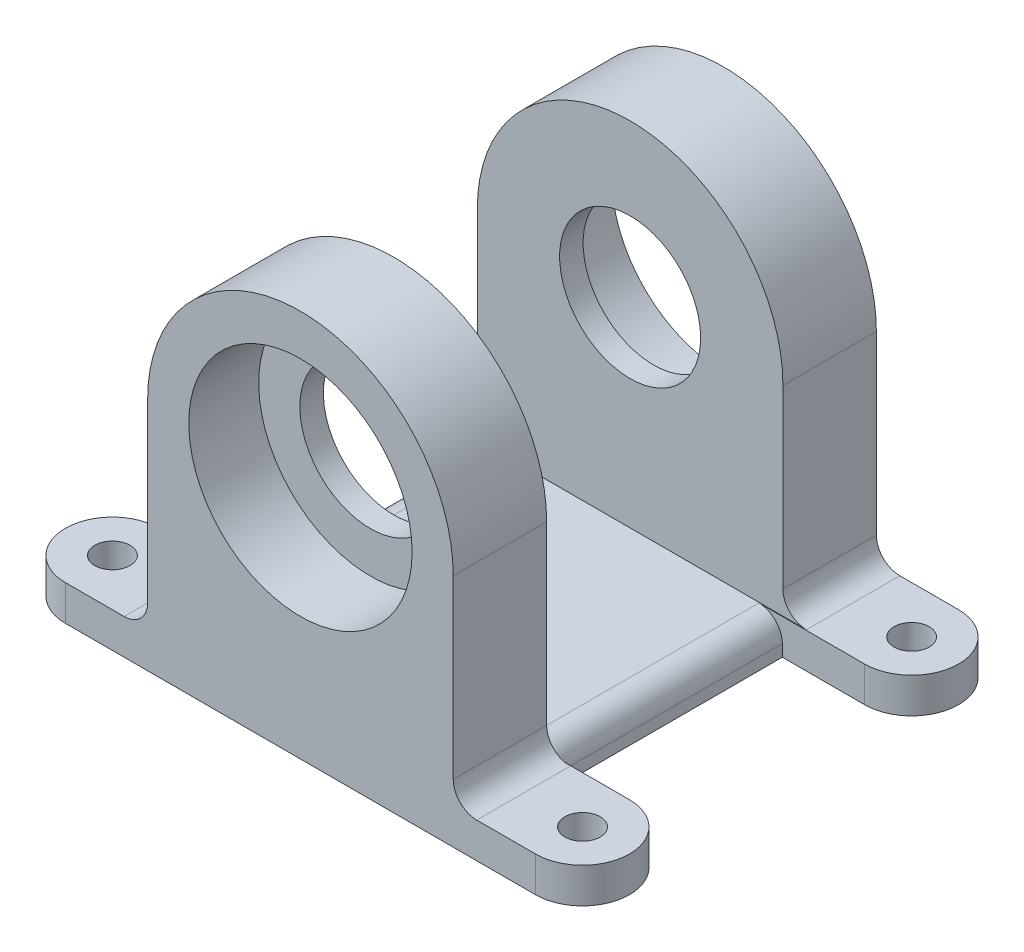
ISO-10303-21;
HEADER;
FILE_DESCRIPTION(('STEP AP214'),'2;1');
FILE_NAME('part.step','',(''),(''),'','','');
FILE_SCHEMA(('AUTOMOTIVE_DESIGN { 1 0 10303 214 1 1 1 1 }'));
ENDSEC;
DATA;
#1=APPLICATION_CONTEXT('core data for automotive mechanical design processes');
#2=APPLICATION_PROTOCOL_DEFINITION('international standard','automotive_design',2000,#1);
#3=PRODUCT_CONTEXT('',#1,'mechanical');
#4=PRODUCT('Part','Part','',(#3));
#5=PRODUCT_RELATED_PRODUCT_CATEGORY('part','',(#4));
#6=PRODUCT_DEFINITION_FORMATION('','',#4);
#7=PRODUCT_DEFINITION_CONTEXT('part definition',#1,'design');
#8=PRODUCT_DEFINITION('design','',#6,#7);
#9=PRODUCT_DEFINITION_SHAPE('','',#8);
#10=(LENGTH_UNIT() NAMED_UNIT(*) SI_UNIT(.MILLI.,.METRE.));
#11=(NAMED_UNIT(*) PLANE_ANGLE_UNIT() SI_UNIT($,.RADIAN.));
#12=(NAMED_UNIT(*) SI_UNIT($,.STERADIAN.) SOLID_ANGLE_UNIT());
#13=UNCERTAINTY_MEASURE_WITH_UNIT(LENGTH_MEASURE(1.E-05),#10,'distance_accuracy_value','');
#14=(GEOMETRIC_REPRESENTATION_CONTEXT(3) GLOBAL_UNCERTAINTY_ASSIGNED_CONTEXT((#13)) GLOBAL_UNIT_ASSIGNED_CONTEXT((#10,
#11,#12)) REPRESENTATION_CONTEXT('',''));
#15=CARTESIAN_POINT('',(0.,0.,0.));
#16=DIRECTION('',(0.,0.,1.));
#17=DIRECTION('',(1.,0.,0.));
#18=AXIS2_PLACEMENT_3D('',#15,#16,#17);
#19=CARTESIAN_POINT('',(-13.,0.,36.));
#20=DIRECTION('',(1.,0.,0.));
#21=DIRECTION('',(0.,1.,0.));
#22=AXIS2_PLACEMENT_3D('',#19,#20,#21);
#23=PLANE('',#22);
#24=DIRECTION('',(0.,-1.,0.));
#25=VECTOR('',#24,1.);
#26=CARTESIAN_POINT('',(-13.,13.,28.05));
#27=LINE('',#26,#25);
#28=CARTESIAN_POINT('',(-13.,0.,28.05));
#29=VERTEX_POINT('',#28);
#30=CARTESIAN_POINT('',(-13.,-15.,28.05));
#31=VERTEX_POINT('',#30);
#32=EDGE_CURVE('E374',#29,#31,#27,.T.);
#33=ORIENTED_EDGE('',*,*,#32,.T.);
#34=DIRECTION('',(0.,0.,1.));
#35=VECTOR('',#34,1.);
#36=CARTESIAN_POINT('',(-13.,-15.,36.));
#37=LINE('',#36,#35);
#38=CARTESIAN_POINT('',(-13.,-15.,36.));
#39=VERTEX_POINT('',#38);
#40=EDGE_CURVE('E252',#31,#39,#37,.T.);
#41=ORIENTED_EDGE('',*,*,#40,.T.);
#42=DIRECTION('',(0.,-1.,0.));
#43=VECTOR('',#42,1.);
#44=CARTESIAN_POINT('',(-13.,0.,36.));
#45=LINE('',#44,#43);
#46=CARTESIAN_POINT('',(-13.,0.,36.));
#47=VERTEX_POINT('',#46);
#48=EDGE_CURVE('E396',#47,#39,#45,.T.);
#49=ORIENTED_EDGE('',*,*,#48,.F.);
#50=DIRECTION('',(0.,0.,-1.));
#51=VECTOR('',#50,1.);
#52=CARTESIAN_POINT('',(-13.,0.,36.));
#53=LINE('',#52,#51);
#54=EDGE_CURVE('E249',#47,#29,#53,.T.);
#55=ORIENTED_EDGE('',*,*,#54,.T.);
#56=EDGE_LOOP('',(#33,#41,#49,#55));
#57=FACE_BOUND('',#56,.T.);
#58=ADVANCED_FACE('F39',(#57),#23,.F.);
#59=DIRECTION('',(0.,-1.,0.));
#60=VECTOR('',#59,1.);
#61=CARTESIAN_POINT('',(-13.,-17.,28.));
#62=LINE('',#61,#60);
#63=CARTESIAN_POINT('',(-13.,-19.,28.));
#64=VERTEX_POINT('',#63);
#65=CARTESIAN_POINT('',(-13.,-20.,28.));
#66=VERTEX_POINT('',#65);
#67=EDGE_CURVE('E475',#64,#66,#62,.T.);
#68=ORIENTED_EDGE('',*,*,#67,.F.);
#69=DIRECTION('',(0.,0.,-1.));
#70=VECTOR('',#69,1.);
#71=CARTESIAN_POINT('',(-13.,-19.,36.));
#72=LINE('',#71,#70);
#73=CARTESIAN_POINT('',(-13.,-19.,8.));
#74=VERTEX_POINT('',#73);
#75=EDGE_CURVE('E288',#64,#74,#72,.T.);
#76=ORIENTED_EDGE('',*,*,#75,.T.);
#77=DIRECTION('',(0.,-1.,0.));
#78=VECTOR('',#77,1.);
#79=CARTESIAN_POINT('',(-13.,-17.,8.));
#80=LINE('',#79,#78);
#81=CARTESIAN_POINT('',(-13.,-20.,7.99999999999999));
#82=VERTEX_POINT('',#81);
#83=EDGE_CURVE('E454',#74,#82,#80,.T.);
#84=ORIENTED_EDGE('',*,*,#83,.T.);
#85=DIRECTION('',(0.,0.,-1.));
#86=VECTOR('',#85,1.);
#87=CARTESIAN_POINT('',(-13.,-20.,36.));
#88=LINE('',#87,#86);
#89=EDGE_CURVE('E238',#66,#82,#88,.T.);
#90=ORIENTED_EDGE('',*,*,#89,.F.);
#91=EDGE_LOOP('',(#68,#76,#84,#90));
#92=FACE_BOUND('',#91,.T.);
#93=ADVANCED_FACE('F510',(#92),#23,.F.);
#94=CARTESIAN_POINT('',(13.,-20.,36.));
#95=DIRECTION('',(-1.,0.,0.));
#96=DIRECTION('',(0.,-1.,0.));
#97=AXIS2_PLACEMENT_3D('',#94,#95,#96);
#98=PLANE('',#97);
#99=DIRECTION('',(0.,1.,0.));
#100=VECTOR('',#99,1.);
#101=CARTESIAN_POINT('',(13.,-17.,7.95));
#102=LINE('',#101,#100);
#103=CARTESIAN_POINT('',(13.,-15.,7.95));
#104=VERTEX_POINT('',#103);
#105=CARTESIAN_POINT('',(13.,0.,7.95));
#106=VERTEX_POINT('',#105);
#107=EDGE_CURVE('E371',#104,#106,#102,.T.);
#108=ORIENTED_EDGE('',*,*,#107,.F.);
#109=DIRECTION('',(0.,0.,-1.));
#110=VECTOR('',#109,1.);
#111=CARTESIAN_POINT('',(13.,-15.,0.));
#112=LINE('',#111,#110);
#113=CARTESIAN_POINT('',(13.,-15.,0.));
#114=VERTEX_POINT('',#113);
#115=EDGE_CURVE('E291',#104,#114,#112,.T.);
#116=ORIENTED_EDGE('',*,*,#115,.T.);
#117=DIRECTION('',(0.,1.,0.));
#118=VECTOR('',#117,1.);
#119=CARTESIAN_POINT('',(13.,-20.,0.));
#120=LINE('',#119,#118);
#121=CARTESIAN_POINT('',(13.,0.,0.));
#122=VERTEX_POINT('',#121);
#123=EDGE_CURVE('E397',#114,#122,#120,.T.);
#124=ORIENTED_EDGE('',*,*,#123,.T.);
#125=DIRECTION('',(0.,0.,-1.));
#126=VECTOR('',#125,1.);
#127=CARTESIAN_POINT('',(13.,0.,36.));
#128=LINE('',#127,#126);
#129=EDGE_CURVE('E245',#106,#122,#128,.T.);
#130=ORIENTED_EDGE('',*,*,#129,.F.);
#131=EDGE_LOOP('',(#108,#116,#124,#130));
#132=FACE_BOUND('',#131,.T.);
#133=ADVANCED_FACE('F415',(#132),#98,.F.);
#134=DIRECTION('',(0.,-1.,0.));
#135=VECTOR('',#134,1.);
#136=CARTESIAN_POINT('',(13.,-17.,8.));
#137=LINE('',#136,#135);
#138=CARTESIAN_POINT('',(13.,-19.,8.));
#139=VERTEX_POINT('',#138);
#140=CARTESIAN_POINT('',(13.,-20.,8.));
#141=VERTEX_POINT('',#140);
#142=EDGE_CURVE('E212',#139,#141,#137,.T.);
#143=ORIENTED_EDGE('',*,*,#142,.F.);
#144=DIRECTION('',(0.,0.,-1.));
#145=VECTOR('',#144,1.);
#146=CARTESIAN_POINT('',(13.,-19.,36.));
#147=LINE('',#146,#145);
#148=CARTESIAN_POINT('',(13.,-19.,28.));
#149=VERTEX_POINT('',#148);
#150=EDGE_CURVE('E294',#139,#149,#147,.F.);
#151=ORIENTED_EDGE('',*,*,#150,.T.);
#152=DIRECTION('',(0.,-1.,0.));
#153=VECTOR('',#152,1.);
#154=CARTESIAN_POINT('',(13.,-17.,28.));
#155=LINE('',#154,#153);
#156=CARTESIAN_POINT('',(13.,-20.,28.));
#157=VERTEX_POINT('',#156);
#158=EDGE_CURVE('E236',#149,#157,#155,.T.);
#159=ORIENTED_EDGE('',*,*,#158,.T.);
#160=DIRECTION('',(0.,0.,-1.));
#161=VECTOR('',#160,1.);
#162=CARTESIAN_POINT('',(13.,-20.,36.));
#163=LINE('',#162,#161);
#164=EDGE_CURVE('E229',#157,#141,#163,.T.);
#165=ORIENTED_EDGE('',*,*,#164,.T.);
#166=EDGE_LOOP('',(#143,#151,#159,#165));
#167=FACE_BOUND('',#166,.T.);
#168=ADVANCED_FACE('F234',(#167),#98,.F.);
#169=CARTESIAN_POINT('',(0.,0.,36.));
#170=DIRECTION('',(0.,0.,-1.));
#171=DIRECTION('',(-1.,0.,0.));
#172=AXIS2_PLACEMENT_3D('',#169,#170,#171);
#173=CYLINDRICAL_SURFACE('',#172,9.5);
#174=CARTESIAN_POINT('',(0.,0.,0.));
#175=DIRECTION('',(0.,0.,1.));
#176=DIRECTION('',(1.,0.,0.));
#177=AXIS2_PLACEMENT_3D('',#174,#175,#176);
#178=CIRCLE('',#177,9.5);
#179=CARTESIAN_POINT('',(9.5,0.,0.));
#180=VERTEX_POINT('',#179);
#181=EDGE_CURVE('E387',#180,#180,#178,.T.);
#182=ORIENTED_EDGE('',*,*,#181,.F.);
#183=EDGE_LOOP('',(#182));
#184=FACE_BOUND('',#183,.T.);
#185=CARTESIAN_POINT('',(0.,0.,5.95));
#186=DIRECTION('',(0.,0.,1.));
#187=DIRECTION('',(1.,0.,0.));
#188=AXIS2_PLACEMENT_3D('',#185,#186,#187);
#189=CIRCLE('',#188,9.5);
#190=CARTESIAN_POINT('',(9.5,0.,5.95));
#191=VERTEX_POINT('',#190);
#192=EDGE_CURVE('E357',#191,#191,#189,.T.);
#193=ORIENTED_EDGE('',*,*,#192,.T.);
#194=EDGE_LOOP('',(#193));
#195=FACE_BOUND('',#194,.T.);
#196=ADVANCED_FACE('F542',(#184,#195),#173,.F.);
#197=CARTESIAN_POINT('',(0.,0.,36.));
#198=DIRECTION('',(0.,0.,1.));
#199=DIRECTION('',(1.,0.,0.));
#200=AXIS2_PLACEMENT_3D('',#197,#198,#199);
#201=CIRCLE('',#200,9.5);
#202=CARTESIAN_POINT('',(9.5,0.,36.));
#203=VERTEX_POINT('',#202);
#204=EDGE_CURVE('E388',#203,#203,#201,.T.);
#205=ORIENTED_EDGE('',*,*,#204,.T.);
#206=EDGE_LOOP('',(#205));
#207=FACE_BOUND('',#206,.T.);
#208=CARTESIAN_POINT('',(0.,0.,30.05));
#209=DIRECTION('',(0.,0.,-1.));
#210=DIRECTION('',(0.,1.,0.));
#211=AXIS2_PLACEMENT_3D('',#208,#209,#210);
#212=CIRCLE('',#211,9.5);
#213=CARTESIAN_POINT('',(0.,9.49999999999999,30.05));
#214=VERTEX_POINT('',#213);
#215=EDGE_CURVE('E366',#214,#214,#212,.T.);
#216=ORIENTED_EDGE('',*,*,#215,.T.);
#217=EDGE_LOOP('',(#216));
#218=FACE_BOUND('',#217,.T.);
#219=ADVANCED_FACE('F536',(#207,#218),#173,.F.);
#220=CARTESIAN_POINT('',(0.,0.,36.));
#221=DIRECTION('',(0.,0.,-1.));
#222=DIRECTION('',(-1.,0.,0.));
#223=AXIS2_PLACEMENT_3D('',#220,#221,#222);
#224=CYLINDRICAL_SURFACE('',#223,13.);
#225=CARTESIAN_POINT('',(13.,0.,36.));
#226=VERTEX_POINT('',#225);
#227=CARTESIAN_POINT('',(13.,0.,28.05));
#228=VERTEX_POINT('',#227);
#229=EDGE_CURVE('E239',#226,#228,#128,.T.);
#230=ORIENTED_EDGE('',*,*,#229,.T.);
#231=CARTESIAN_POINT('',(0.,0.,28.05));
#232=DIRECTION('',(0.,0.,1.));
#233=DIRECTION('',(0.,-1.,0.));
#234=AXIS2_PLACEMENT_3D('',#231,#232,#233);
#235=CIRCLE('',#234,13.);
#236=EDGE_CURVE('E385',#228,#29,#235,.T.);
#237=ORIENTED_EDGE('',*,*,#236,.T.);
#238=ORIENTED_EDGE('',*,*,#54,.F.);
#239=CARTESIAN_POINT('',(0.,0.,36.));
#240=DIRECTION('',(0.,0.,1.));
#241=DIRECTION('',(1.,0.,0.));
#242=AXIS2_PLACEMENT_3D('',#239,#240,#241);
#243=CIRCLE('',#242,13.);
#244=EDGE_CURVE('E394',#226,#47,#243,.T.);
#245=ORIENTED_EDGE('',*,*,#244,.F.);
#246=EDGE_LOOP('',(#230,#237,#238,#245));
#247=FACE_BOUND('',#246,.T.);
#248=ADVANCED_FACE('F529',(#247),#224,.T.);
#249=CARTESIAN_POINT('',(0.,0.,36.));
#250=DIRECTION('',(0.,0.,1.));
#251=DIRECTION('',(1.,0.,0.));
#252=AXIS2_PLACEMENT_3D('',#249,#250,#251);
#253=PLANE('',#252);
#254=ORIENTED_EDGE('',*,*,#244,.T.);
#255=ORIENTED_EDGE('',*,*,#48,.T.);
#256=CARTESIAN_POINT('',(-15.,-15.,36.));
#257=DIRECTION('',(0.,0.,1.));
#258=DIRECTION('',(1.,0.,0.));
#259=AXIS2_PLACEMENT_3D('',#256,#257,#258);
#260=CIRCLE('',#259,2.);
#261=CARTESIAN_POINT('',(-15.,-17.,36.));
#262=VERTEX_POINT('',#261);
#263=EDGE_CURVE('E298',#39,#262,#260,.F.);
#264=ORIENTED_EDGE('',*,*,#263,.T.);
#265=DIRECTION('',(-1.,0.,0.));
#266=VECTOR('',#265,1.);
#267=CARTESIAN_POINT('',(-13.,-17.,36.));
#268=LINE('',#267,#266);
#269=CARTESIAN_POINT('',(-20.,-17.,36.));
#270=VERTEX_POINT('',#269);
#271=EDGE_CURVE('E490',#262,#270,#268,.T.);
#272=ORIENTED_EDGE('',*,*,#271,.T.);
#273=DIRECTION('',(0.,-1.,0.));
#274=VECTOR('',#273,1.);
#275=CARTESIAN_POINT('',(-20.,-17.,36.));
#276=LINE('',#275,#274);
#277=CARTESIAN_POINT('',(-20.,-20.,36.));
#278=VERTEX_POINT('',#277);
#279=EDGE_CURVE('E478',#270,#278,#276,.T.);
#280=ORIENTED_EDGE('',*,*,#279,.T.);
#281=DIRECTION('',(1.,0.,0.));
#282=VECTOR('',#281,1.);
#283=CARTESIAN_POINT('',(-13.,-20.,36.));
#284=LINE('',#283,#282);
#285=CARTESIAN_POINT('',(20.,-20.,36.));
#286=VERTEX_POINT('',#285);
#287=EDGE_CURVE('E400',#278,#286,#284,.T.);
#288=ORIENTED_EDGE('',*,*,#287,.T.);
#289=DIRECTION('',(0.,-1.,0.));
#290=VECTOR('',#289,1.);
#291=CARTESIAN_POINT('',(20.,-17.,36.));
#292=LINE('',#291,#290);
#293=CARTESIAN_POINT('',(20.,-17.,36.));
#294=VERTEX_POINT('',#293);
#295=EDGE_CURVE('E336',#294,#286,#292,.T.);
#296=ORIENTED_EDGE('',*,*,#295,.F.);
#297=DIRECTION('',(-1.,0.,0.));
#298=VECTOR('',#297,1.);
#299=CARTESIAN_POINT('',(13.,-17.,36.));
#300=LINE('',#299,#298);
#301=CARTESIAN_POINT('',(15.,-17.,36.));
#302=VERTEX_POINT('',#301);
#303=EDGE_CURVE('E331',#294,#302,#300,.T.);
#304=ORIENTED_EDGE('',*,*,#303,.T.);
#305=CARTESIAN_POINT('',(15.,-15.,36.));
#306=DIRECTION('',(0.,0.,1.));
#307=DIRECTION('',(1.,0.,0.));
#308=AXIS2_PLACEMENT_3D('',#305,#306,#307);
#309=CIRCLE('',#308,2.);
#310=CARTESIAN_POINT('',(13.,-15.,36.));
#311=VERTEX_POINT('',#310);
#312=EDGE_CURVE('E11',#302,#311,#309,.F.);
#313=ORIENTED_EDGE('',*,*,#312,.T.);
#314=DIRECTION('',(0.,1.,0.));
#315=VECTOR('',#314,1.);
#316=CARTESIAN_POINT('',(13.,-20.,36.));
#317=LINE('',#316,#315);
#318=EDGE_CURVE('E402',#311,#226,#317,.T.);
#319=ORIENTED_EDGE('',*,*,#318,.T.);
#320=EDGE_LOOP('',(#254,#255,#264,#272,#280,#288,#296,#304,#313,#319));
#321=FACE_BOUND('',#320,.T.);
#322=ORIENTED_EDGE('',*,*,#204,.F.);
#323=EDGE_LOOP('',(#322));
#324=FACE_BOUND('',#323,.T.);
#325=ADVANCED_FACE('F333',(#321,#324),#253,.T.);
#326=CARTESIAN_POINT('',(0.,0.,0.));
#327=DIRECTION('',(0.,0.,1.));
#328=DIRECTION('',(1.,0.,0.));
#329=AXIS2_PLACEMENT_3D('',#326,#327,#328);
#330=PLANE('',#329);
#331=CARTESIAN_POINT('',(0.,0.,0.));
#332=DIRECTION('',(0.,0.,1.));
#333=DIRECTION('',(1.,0.,0.));
#334=AXIS2_PLACEMENT_3D('',#331,#332,#333);
#335=CIRCLE('',#334,13.);
#336=CARTESIAN_POINT('',(-13.,0.,0.));
#337=VERTEX_POINT('',#336);
#338=EDGE_CURVE('E391',#122,#337,#335,.T.);
#339=ORIENTED_EDGE('',*,*,#338,.F.);
#340=ORIENTED_EDGE('',*,*,#123,.F.);
#341=CARTESIAN_POINT('',(15.,-15.,0.));
#342=DIRECTION('',(0.,0.,1.));
#343=DIRECTION('',(1.,0.,0.));
#344=AXIS2_PLACEMENT_3D('',#341,#342,#343);
#345=CIRCLE('',#344,2.);
#346=CARTESIAN_POINT('',(15.,-17.,0.));
#347=VERTEX_POINT('',#346);
#348=EDGE_CURVE('E312',#114,#347,#345,.T.);
#349=ORIENTED_EDGE('',*,*,#348,.T.);
#350=DIRECTION('',(1.,0.,0.));
#351=VECTOR('',#350,1.);
#352=CARTESIAN_POINT('',(13.,-17.,0.));
#353=LINE('',#352,#351);
#354=CARTESIAN_POINT('',(20.,-17.,0.));
#355=VERTEX_POINT('',#354);
#356=EDGE_CURVE('E232',#347,#355,#353,.T.);
#357=ORIENTED_EDGE('',*,*,#356,.T.);
#358=DIRECTION('',(0.,-1.,0.));
#359=VECTOR('',#358,1.);
#360=CARTESIAN_POINT('',(20.,-17.,0.));
#361=LINE('',#360,#359);
#362=CARTESIAN_POINT('',(20.,-20.,0.));
#363=VERTEX_POINT('',#362);
#364=EDGE_CURVE('E578',#355,#363,#361,.T.);
#365=ORIENTED_EDGE('',*,*,#364,.T.);
#366=DIRECTION('',(1.,0.,0.));
#367=VECTOR('',#366,1.);
#368=CARTESIAN_POINT('',(-13.,-20.,0.));
#369=LINE('',#368,#367);
#370=CARTESIAN_POINT('',(-20.,-20.,0.));
#371=VERTEX_POINT('',#370);
#372=EDGE_CURVE('E409',#371,#363,#369,.T.);
#373=ORIENTED_EDGE('',*,*,#372,.F.);
#374=DIRECTION('',(0.,-1.,0.));
#375=VECTOR('',#374,1.);
#376=CARTESIAN_POINT('',(-20.,-17.,0.));
#377=LINE('',#376,#375);
#378=CARTESIAN_POINT('',(-20.,-17.,0.));
#379=VERTEX_POINT('',#378);
#380=EDGE_CURVE('E459',#379,#371,#377,.T.);
#381=ORIENTED_EDGE('',*,*,#380,.F.);
#382=DIRECTION('',(1.,0.,0.));
#383=VECTOR('',#382,1.);
#384=CARTESIAN_POINT('',(-13.,-17.,0.));
#385=LINE('',#384,#383);
#386=CARTESIAN_POINT('',(-15.,-17.,0.));
#387=VERTEX_POINT('',#386);
#388=EDGE_CURVE('E456',#379,#387,#385,.T.);
#389=ORIENTED_EDGE('',*,*,#388,.T.);
#390=CARTESIAN_POINT('',(-15.,-15.,0.));
#391=DIRECTION('',(0.,0.,1.));
#392=DIRECTION('',(1.,0.,0.));
#393=AXIS2_PLACEMENT_3D('',#390,#391,#392);
#394=CIRCLE('',#393,2.);
#395=CARTESIAN_POINT('',(-13.,-15.,0.));
#396=VERTEX_POINT('',#395);
#397=EDGE_CURVE('E305',#387,#396,#394,.T.);
#398=ORIENTED_EDGE('',*,*,#397,.T.);
#399=DIRECTION('',(0.,-1.,0.));
#400=VECTOR('',#399,1.);
#401=CARTESIAN_POINT('',(-13.,0.,0.));
#402=LINE('',#401,#400);
#403=EDGE_CURVE('E406',#337,#396,#402,.T.);
#404=ORIENTED_EDGE('',*,*,#403,.F.);
#405=EDGE_LOOP('',(#339,#340,#349,#357,#365,#373,#381,#389,#398,#404));
#406=FACE_BOUND('',#405,.T.);
#407=ORIENTED_EDGE('',*,*,#181,.T.);
#408=EDGE_LOOP('',(#407));
#409=FACE_BOUND('',#408,.T.);
#410=ADVANCED_FACE('F424',(#406,#409),#330,.F.);
#411=CARTESIAN_POINT('',(-13.,0.,7.95));
#412=VERTEX_POINT('',#411);
#413=EDGE_CURVE('E242',#412,#337,#53,.T.);
#414=ORIENTED_EDGE('',*,*,#413,.F.);
#415=CARTESIAN_POINT('',(0.,0.,7.95));
#416=DIRECTION('',(0.,0.,-1.));
#417=DIRECTION('',(-1.,0.,0.));
#418=AXIS2_PLACEMENT_3D('',#415,#416,#417);
#419=CIRCLE('',#418,13.);
#420=EDGE_CURVE('E381',#412,#106,#419,.T.);
#421=ORIENTED_EDGE('',*,*,#420,.T.);
#422=ORIENTED_EDGE('',*,*,#129,.T.);
#423=ORIENTED_EDGE('',*,*,#338,.T.);
#424=EDGE_LOOP('',(#414,#421,#422,#423));
#425=FACE_BOUND('',#424,.T.);
#426=ADVANCED_FACE('F421',(#425),#224,.T.);
#427=ORIENTED_EDGE('',*,*,#403,.T.);
#428=DIRECTION('',(0.,0.,1.));
#429=VECTOR('',#428,1.);
#430=CARTESIAN_POINT('',(-13.,-15.,7.95));
#431=LINE('',#430,#429);
#432=CARTESIAN_POINT('',(-13.,-15.,7.95));
#433=VERTEX_POINT('',#432);
#434=EDGE_CURVE('E285',#396,#433,#431,.T.);
#435=ORIENTED_EDGE('',*,*,#434,.T.);
#436=DIRECTION('',(0.,1.,0.));
#437=VECTOR('',#436,1.);
#438=CARTESIAN_POINT('',(-13.,-17.,7.95));
#439=LINE('',#438,#437);
#440=EDGE_CURVE('E372',#433,#412,#439,.T.);
#441=ORIENTED_EDGE('',*,*,#440,.T.);
#442=ORIENTED_EDGE('',*,*,#413,.T.);
#443=EDGE_LOOP('',(#427,#435,#441,#442));
#444=FACE_BOUND('',#443,.T.);
#445=ADVANCED_FACE('F430',(#444),#23,.F.);
#446=CARTESIAN_POINT('',(-13.,-20.,36.));
#447=DIRECTION('',(0.,1.,0.));
#448=DIRECTION('',(0.,0.,1.));
#449=AXIS2_PLACEMENT_3D('',#446,#447,#448);
#450=PLANE('',#449);
#451=CARTESIAN_POINT('',(20.,-20.,32.));
#452=DIRECTION('',(0.,-1.,0.));
#453=DIRECTION('',(0.,0.,-1.));
#454=AXIS2_PLACEMENT_3D('',#451,#452,#453);
#455=CIRCLE('',#454,1.5);
#456=CARTESIAN_POINT('',(20.,-20.,30.5));
#457=VERTEX_POINT('',#456);
#458=EDGE_CURVE('E587',#457,#457,#455,.T.);
#459=ORIENTED_EDGE('',*,*,#458,.F.);
#460=EDGE_LOOP('',(#459));
#461=FACE_BOUND('',#460,.T.);
#462=CARTESIAN_POINT('',(-20.,-20.,4.));
#463=DIRECTION('',(0.,-1.,0.));
#464=DIRECTION('',(0.,0.,-1.));
#465=AXIS2_PLACEMENT_3D('',#462,#463,#464);
#466=CIRCLE('',#465,1.5);
#467=CARTESIAN_POINT('',(-20.,-20.,2.5));
#468=VERTEX_POINT('',#467);
#469=EDGE_CURVE('E588',#468,#468,#466,.T.);
#470=ORIENTED_EDGE('',*,*,#469,.F.);
#471=EDGE_LOOP('',(#470));
#472=FACE_BOUND('',#471,.T.);
#473=CARTESIAN_POINT('',(20.,-20.,4.));
#474=DIRECTION('',(0.,-1.,0.));
#475=DIRECTION('',(0.,0.,-1.));
#476=AXIS2_PLACEMENT_3D('',#473,#474,#475);
#477=CIRCLE('',#476,1.5);
#478=CARTESIAN_POINT('',(20.,-20.,2.5));
#479=VERTEX_POINT('',#478);
#480=EDGE_CURVE('E591',#479,#479,#477,.T.);
#481=ORIENTED_EDGE('',*,*,#480,.F.);
#482=EDGE_LOOP('',(#481));
#483=FACE_BOUND('',#482,.T.);
#484=CARTESIAN_POINT('',(-20.,-20.,32.));
#485=DIRECTION('',(0.,-1.,0.));
#486=DIRECTION('',(0.,0.,-1.));
#487=AXIS2_PLACEMENT_3D('',#484,#485,#486);
#488=CIRCLE('',#487,1.5);
#489=CARTESIAN_POINT('',(-20.,-20.,30.5));
#490=VERTEX_POINT('',#489);
#491=EDGE_CURVE('E257',#490,#490,#488,.T.);
#492=ORIENTED_EDGE('',*,*,#491,.F.);
#493=EDGE_LOOP('',(#492));
#494=FACE_BOUND('',#493,.T.);
#495=ORIENTED_EDGE('',*,*,#372,.T.);
#496=CARTESIAN_POINT('',(20.,-20.,4.));
#497=DIRECTION('',(0.,-1.,0.));
#498=DIRECTION('',(0.,0.,-1.));
#499=AXIS2_PLACEMENT_3D('',#496,#497,#498);
#500=CIRCLE('',#499,4.);
#501=CARTESIAN_POINT('',(20.,-20.,8.));
#502=VERTEX_POINT('',#501);
#503=EDGE_CURVE('E231',#363,#502,#500,.T.);
#504=ORIENTED_EDGE('',*,*,#503,.T.);
#505=DIRECTION('',(-1.,0.,0.));
#506=VECTOR('',#505,1.);
#507=CARTESIAN_POINT('',(20.,-20.,8.));
#508=LINE('',#507,#506);
#509=EDGE_CURVE('E215',#502,#141,#508,.T.);
#510=ORIENTED_EDGE('',*,*,#509,.T.);
#511=ORIENTED_EDGE('',*,*,#164,.F.);
#512=DIRECTION('',(1.,0.,0.));
#513=VECTOR('',#512,1.);
#514=CARTESIAN_POINT('',(20.,-20.,28.));
#515=LINE('',#514,#513);
#516=CARTESIAN_POINT('',(20.,-20.,28.));
#517=VERTEX_POINT('',#516);
#518=EDGE_CURVE('E346',#157,#517,#515,.T.);
#519=ORIENTED_EDGE('',*,*,#518,.T.);
#520=CARTESIAN_POINT('',(20.,-20.,32.));
#521=DIRECTION('',(0.,-1.,0.));
#522=DIRECTION('',(0.,0.,1.));
#523=AXIS2_PLACEMENT_3D('',#520,#521,#522);
#524=CIRCLE('',#523,3.99999999999999);
#525=EDGE_CURVE('E348',#517,#286,#524,.T.);
#526=ORIENTED_EDGE('',*,*,#525,.T.);
#527=ORIENTED_EDGE('',*,*,#287,.F.);
#528=CARTESIAN_POINT('',(-20.,-20.,32.));
#529=DIRECTION('',(0.,-1.,0.));
#530=DIRECTION('',(0.,0.,-1.));
#531=AXIS2_PLACEMENT_3D('',#528,#529,#530);
#532=CIRCLE('',#531,4.);
#533=CARTESIAN_POINT('',(-20.,-20.,28.));
#534=VERTEX_POINT('',#533);
#535=EDGE_CURVE('E482',#278,#534,#532,.T.);
#536=ORIENTED_EDGE('',*,*,#535,.T.);
#537=DIRECTION('',(1.,0.,0.));
#538=VECTOR('',#537,1.);
#539=CARTESIAN_POINT('',(-20.,-20.,28.));
#540=LINE('',#539,#538);
#541=EDGE_CURVE('E462',#534,#66,#540,.T.);
#542=ORIENTED_EDGE('',*,*,#541,.T.);
#543=ORIENTED_EDGE('',*,*,#89,.T.);
#544=DIRECTION('',(-1.,0.,0.));
#545=VECTOR('',#544,1.);
#546=CARTESIAN_POINT('',(-20.,-20.,7.99999999999999));
#547=LINE('',#546,#545);
#548=CARTESIAN_POINT('',(-20.,-20.,7.99999999999999));
#549=VERTEX_POINT('',#548);
#550=EDGE_CURVE('E222',#82,#549,#547,.T.);
#551=ORIENTED_EDGE('',*,*,#550,.T.);
#552=CARTESIAN_POINT('',(-20.,-20.,4.));
#553=DIRECTION('',(0.,-1.,0.));
#554=DIRECTION('',(0.,0.,1.));
#555=AXIS2_PLACEMENT_3D('',#552,#553,#554);
#556=CIRCLE('',#555,4.);
#557=EDGE_CURVE('E463',#549,#371,#556,.T.);
#558=ORIENTED_EDGE('',*,*,#557,.T.);
#559=EDGE_LOOP('',(#495,#504,#510,#511,#519,#526,#527,#536,#542,#543,#551,#558));
#560=FACE_BOUND('',#559,.T.);
#561=ADVANCED_FACE('F227',(#461,#472,#483,#494,#560),#450,.F.);
#562=ORIENTED_EDGE('',*,*,#318,.F.);
#563=DIRECTION('',(0.,0.,-1.));
#564=VECTOR('',#563,1.);
#565=CARTESIAN_POINT('',(13.,-15.,28.05));
#566=LINE('',#565,#564);
#567=CARTESIAN_POINT('',(13.,-15.,28.05));
#568=VERTEX_POINT('',#567);
#569=EDGE_CURVE('E296',#311,#568,#566,.T.);
#570=ORIENTED_EDGE('',*,*,#569,.T.);
#571=DIRECTION('',(0.,-1.,0.));
#572=VECTOR('',#571,1.);
#573=CARTESIAN_POINT('',(13.,13.,28.05));
#574=LINE('',#573,#572);
#575=EDGE_CURVE('E325',#228,#568,#574,.T.);
#576=ORIENTED_EDGE('',*,*,#575,.F.);
#577=ORIENTED_EDGE('',*,*,#229,.F.);
#578=EDGE_LOOP('',(#562,#570,#576,#577));
#579=FACE_BOUND('',#578,.T.);
#580=ADVANCED_FACE('F526',(#579),#98,.F.);
#581=CARTESIAN_POINT('',(-13.,13.,28.05));
#582=DIRECTION('',(0.,0.,1.));
#583=DIRECTION('',(0.,-1.,0.));
#584=AXIS2_PLACEMENT_3D('',#581,#582,#583);
#585=PLANE('',#584);
#586=ORIENTED_EDGE('',*,*,#575,.T.);
#587=CARTESIAN_POINT('',(15.,-15.,28.05));
#588=DIRECTION('',(0.,0.,1.));
#589=DIRECTION('',(0.,-1.,0.));
#590=AXIS2_PLACEMENT_3D('',#587,#588,#589);
#591=CIRCLE('',#590,2.);
#592=CARTESIAN_POINT('',(15.,-17.,28.05));
#593=VERTEX_POINT('',#592);
#594=EDGE_CURVE('E47',#568,#593,#591,.T.);
#595=ORIENTED_EDGE('',*,*,#594,.T.);
#596=DIRECTION('',(1.,0.,0.));
#597=VECTOR('',#596,1.);
#598=CARTESIAN_POINT('',(-13.,-17.,28.05));
#599=LINE('',#598,#597);
#600=CARTESIAN_POINT('',(-15.,-17.,28.05));
#601=VERTEX_POINT('',#600);
#602=EDGE_CURVE('E323',#601,#593,#599,.T.);
#603=ORIENTED_EDGE('',*,*,#602,.F.);
#604=CARTESIAN_POINT('',(-15.,-15.,28.05));
#605=DIRECTION('',(0.,0.,1.));
#606=DIRECTION('',(0.,-1.,0.));
#607=AXIS2_PLACEMENT_3D('',#604,#605,#606);
#608=CIRCLE('',#607,2.);
#609=EDGE_CURVE('E300',#601,#31,#608,.T.);
#610=ORIENTED_EDGE('',*,*,#609,.T.);
#611=ORIENTED_EDGE('',*,*,#32,.F.);
#612=ORIENTED_EDGE('',*,*,#236,.F.);
#613=EDGE_LOOP('',(#586,#595,#603,#610,#611,#612));
#614=FACE_BOUND('',#613,.T.);
#615=CARTESIAN_POINT('',(0.,0.,28.05));
#616=DIRECTION('',(0.,0.,-1.));
#617=DIRECTION('',(0.,1.,0.));
#618=AXIS2_PLACEMENT_3D('',#615,#616,#617);
#619=CIRCLE('',#618,6.);
#620=CARTESIAN_POINT('',(0.,5.99999999999999,28.05));
#621=VERTEX_POINT('',#620);
#622=EDGE_CURVE('E362',#621,#621,#619,.T.);
#623=ORIENTED_EDGE('',*,*,#622,.F.);
#624=EDGE_LOOP('',(#623));
#625=FACE_BOUND('',#624,.T.);
#626=ADVANCED_FACE('F321',(#614,#625),#585,.F.);
#627=CARTESIAN_POINT('',(-13.,-17.,7.95));
#628=DIRECTION('',(0.,0.,-1.));
#629=DIRECTION('',(-1.,0.,0.));
#630=AXIS2_PLACEMENT_3D('',#627,#628,#629);
#631=PLANE('',#630);
#632=ORIENTED_EDGE('',*,*,#440,.F.);
#633=CARTESIAN_POINT('',(-15.,-15.,7.95));
#634=DIRECTION('',(0.,0.,-1.));
#635=DIRECTION('',(-1.,0.,0.));
#636=AXIS2_PLACEMENT_3D('',#633,#634,#635);
#637=CIRCLE('',#636,2.);
#638=CARTESIAN_POINT('',(-15.,-17.,7.95));
#639=VERTEX_POINT('',#638);
#640=EDGE_CURVE('E302',#433,#639,#637,.T.);
#641=ORIENTED_EDGE('',*,*,#640,.T.);
#642=DIRECTION('',(1.,0.,0.));
#643=VECTOR('',#642,1.);
#644=CARTESIAN_POINT('',(-13.,-17.,7.95));
#645=LINE('',#644,#643);
#646=CARTESIAN_POINT('',(15.,-17.,7.95));
#647=VERTEX_POINT('',#646);
#648=EDGE_CURVE('E377',#639,#647,#645,.T.);
#649=ORIENTED_EDGE('',*,*,#648,.T.);
#650=CARTESIAN_POINT('',(15.,-15.,7.95));
#651=DIRECTION('',(0.,0.,-1.));
#652=DIRECTION('',(-1.,0.,0.));
#653=AXIS2_PLACEMENT_3D('',#650,#651,#652);
#654=CIRCLE('',#653,2.);
#655=EDGE_CURVE('E314',#647,#104,#654,.T.);
#656=ORIENTED_EDGE('',*,*,#655,.T.);
#657=ORIENTED_EDGE('',*,*,#107,.T.);
#658=ORIENTED_EDGE('',*,*,#420,.F.);
#659=EDGE_LOOP('',(#632,#641,#649,#656,#657,#658));
#660=FACE_BOUND('',#659,.T.);
#661=CARTESIAN_POINT('',(0.,0.,7.95));
#662=DIRECTION('',(0.,0.,1.));
#663=DIRECTION('',(1.,0.,0.));
#664=AXIS2_PLACEMENT_3D('',#661,#662,#663);
#665=CIRCLE('',#664,6.);
#666=CARTESIAN_POINT('',(6.,0.,7.95));
#667=VERTEX_POINT('',#666);
#668=EDGE_CURVE('E352',#667,#667,#665,.T.);
#669=ORIENTED_EDGE('',*,*,#668,.F.);
#670=EDGE_LOOP('',(#669));
#671=FACE_BOUND('',#670,.T.);
#672=ADVANCED_FACE('F436',(#660,#671),#631,.F.);
#673=CARTESIAN_POINT('',(-13.,-17.,28.05));
#674=DIRECTION('',(0.,-1.,0.));
#675=DIRECTION('',(1.,0.,0.));
#676=AXIS2_PLACEMENT_3D('',#673,#674,#675);
#677=PLANE('',#676);
#678=CARTESIAN_POINT('',(20.,-17.,32.));
#679=DIRECTION('',(0.,-1.,0.));
#680=DIRECTION('',(1.,0.,0.));
#681=AXIS2_PLACEMENT_3D('',#678,#679,#680);
#682=CIRCLE('',#681,1.5);
#683=CARTESIAN_POINT('',(21.5,-17.,32.));
#684=VERTEX_POINT('',#683);
#685=EDGE_CURVE('E263',#684,#684,#682,.T.);
#686=ORIENTED_EDGE('',*,*,#685,.T.);
#687=EDGE_LOOP('',(#686));
#688=FACE_BOUND('',#687,.T.);
#689=CARTESIAN_POINT('',(-20.,-17.,4.));
#690=DIRECTION('',(0.,-1.,0.));
#691=DIRECTION('',(1.,0.,0.));
#692=AXIS2_PLACEMENT_3D('',#689,#690,#691);
#693=CIRCLE('',#692,1.5);
#694=CARTESIAN_POINT('',(-18.5,-17.,4.));
#695=VERTEX_POINT('',#694);
#696=EDGE_CURVE('E260',#695,#695,#693,.T.);
#697=ORIENTED_EDGE('',*,*,#696,.T.);
#698=EDGE_LOOP('',(#697));
#699=FACE_BOUND('',#698,.T.);
#700=CARTESIAN_POINT('',(20.,-17.,4.));
#701=DIRECTION('',(0.,-1.,0.));
#702=DIRECTION('',(1.,0.,0.));
#703=AXIS2_PLACEMENT_3D('',#700,#701,#702);
#704=CIRCLE('',#703,1.5);
#705=CARTESIAN_POINT('',(21.5,-17.,4.));
#706=VERTEX_POINT('',#705);
#707=EDGE_CURVE('E256',#706,#706,#704,.T.);
#708=ORIENTED_EDGE('',*,*,#707,.T.);
#709=EDGE_LOOP('',(#708));
#710=FACE_BOUND('',#709,.T.);
#711=CARTESIAN_POINT('',(-20.,-17.,32.));
#712=DIRECTION('',(0.,-1.,0.));
#713=DIRECTION('',(1.,0.,0.));
#714=AXIS2_PLACEMENT_3D('',#711,#712,#713);
#715=CIRCLE('',#714,1.5);
#716=CARTESIAN_POINT('',(-18.5,-17.,32.));
#717=VERTEX_POINT('',#716);
#718=EDGE_CURVE('E253',#717,#717,#715,.T.);
#719=ORIENTED_EDGE('',*,*,#718,.T.);
#720=EDGE_LOOP('',(#719));
#721=FACE_BOUND('',#720,.T.);
#722=ORIENTED_EDGE('',*,*,#271,.F.);
#723=DIRECTION('',(0.,0.,1.));
#724=VECTOR('',#723,1.);
#725=CARTESIAN_POINT('',(-15.,-17.,28.05));
#726=LINE('',#725,#724);
#727=EDGE_CURVE('E282',#262,#601,#726,.F.);
#728=ORIENTED_EDGE('',*,*,#727,.T.);
#729=ORIENTED_EDGE('',*,*,#602,.T.);
#730=DIRECTION('',(0.,0.,-1.));
#731=VECTOR('',#730,1.);
#732=CARTESIAN_POINT('',(15.,-17.,36.));
#733=LINE('',#732,#731);
#734=EDGE_CURVE('E269',#593,#302,#733,.F.);
#735=ORIENTED_EDGE('',*,*,#734,.T.);
#736=ORIENTED_EDGE('',*,*,#303,.F.);
#737=CARTESIAN_POINT('',(20.,-17.,32.));
#738=DIRECTION('',(0.,-1.,0.));
#739=DIRECTION('',(0.,0.,1.));
#740=AXIS2_PLACEMENT_3D('',#737,#738,#739);
#741=CIRCLE('',#740,3.99999999999999);
#742=CARTESIAN_POINT('',(20.,-17.,28.));
#743=VERTEX_POINT('',#742);
#744=EDGE_CURVE('E338',#743,#294,#741,.T.);
#745=ORIENTED_EDGE('',*,*,#744,.F.);
#746=DIRECTION('',(1.,0.,0.));
#747=VECTOR('',#746,1.);
#748=CARTESIAN_POINT('',(20.,-17.,28.));
#749=LINE('',#748,#747);
#750=CARTESIAN_POINT('',(11.,-17.,28.));
#751=VERTEX_POINT('',#750);
#752=EDGE_CURVE('E342',#751,#743,#749,.T.);
#753=ORIENTED_EDGE('',*,*,#752,.F.);
#754=DIRECTION('',(0.,0.,-1.));
#755=VECTOR('',#754,1.);
#756=CARTESIAN_POINT('',(11.,-17.,28.05));
#757=LINE('',#756,#755);
#758=CARTESIAN_POINT('',(11.,-17.,8.));
#759=VERTEX_POINT('',#758);
#760=EDGE_CURVE('E271',#751,#759,#757,.T.);
#761=ORIENTED_EDGE('',*,*,#760,.T.);
#762=DIRECTION('',(-1.,0.,0.));
#763=VECTOR('',#762,1.);
#764=CARTESIAN_POINT('',(20.,-17.,8.));
#765=LINE('',#764,#763);
#766=CARTESIAN_POINT('',(20.,-17.,8.));
#767=VERTEX_POINT('',#766);
#768=EDGE_CURVE('E450',#767,#759,#765,.T.);
#769=ORIENTED_EDGE('',*,*,#768,.F.);
#770=CARTESIAN_POINT('',(20.,-17.,4.));
#771=DIRECTION('',(0.,-1.,0.));
#772=DIRECTION('',(0.,0.,-1.));
#773=AXIS2_PLACEMENT_3D('',#770,#771,#772);
#774=CIRCLE('',#773,4.);
#775=EDGE_CURVE('E448',#355,#767,#774,.T.);
#776=ORIENTED_EDGE('',*,*,#775,.F.);
#777=ORIENTED_EDGE('',*,*,#356,.F.);
#778=DIRECTION('',(0.,0.,-1.));
#779=VECTOR('',#778,1.);
#780=CARTESIAN_POINT('',(15.,-17.,7.95));
#781=LINE('',#780,#779);
#782=EDGE_CURVE('E274',#347,#647,#781,.F.);
#783=ORIENTED_EDGE('',*,*,#782,.T.);
#784=ORIENTED_EDGE('',*,*,#648,.F.);
#785=DIRECTION('',(0.,0.,1.));
#786=VECTOR('',#785,1.);
#787=CARTESIAN_POINT('',(-15.,-17.,0.));
#788=LINE('',#787,#786);
#789=EDGE_CURVE('E280',#639,#387,#788,.F.);
#790=ORIENTED_EDGE('',*,*,#789,.T.);
#791=ORIENTED_EDGE('',*,*,#388,.F.);
#792=CARTESIAN_POINT('',(-20.,-17.,4.));
#793=DIRECTION('',(0.,-1.,0.));
#794=DIRECTION('',(0.,0.,1.));
#795=AXIS2_PLACEMENT_3D('',#792,#793,#794);
#796=CIRCLE('',#795,4.);
#797=CARTESIAN_POINT('',(-20.,-17.,7.99999999999999));
#798=VERTEX_POINT('',#797);
#799=EDGE_CURVE('E470',#798,#379,#796,.T.);
#800=ORIENTED_EDGE('',*,*,#799,.F.);
#801=DIRECTION('',(-1.,0.,0.));
#802=VECTOR('',#801,1.);
#803=CARTESIAN_POINT('',(-20.,-17.,7.99999999999999));
#804=LINE('',#803,#802);
#805=CARTESIAN_POINT('',(-11.,-17.,8.));
#806=VERTEX_POINT('',#805);
#807=EDGE_CURVE('E466',#806,#798,#804,.T.);
#808=ORIENTED_EDGE('',*,*,#807,.F.);
#809=DIRECTION('',(0.,0.,-1.));
#810=VECTOR('',#809,1.);
#811=CARTESIAN_POINT('',(-11.,-17.,28.05));
#812=LINE('',#811,#810);
#813=CARTESIAN_POINT('',(-11.,-17.,28.));
#814=VERTEX_POINT('',#813);
#815=EDGE_CURVE('E277',#806,#814,#812,.F.);
#816=ORIENTED_EDGE('',*,*,#815,.T.);
#817=DIRECTION('',(1.,0.,0.));
#818=VECTOR('',#817,1.);
#819=CARTESIAN_POINT('',(-20.,-17.,28.));
#820=LINE('',#819,#818);
#821=CARTESIAN_POINT('',(-20.,-17.,28.));
#822=VERTEX_POINT('',#821);
#823=EDGE_CURVE('E485',#822,#814,#820,.T.);
#824=ORIENTED_EDGE('',*,*,#823,.F.);
#825=CARTESIAN_POINT('',(-20.,-17.,32.));
#826=DIRECTION('',(0.,-1.,0.));
#827=DIRECTION('',(0.,0.,-1.));
#828=AXIS2_PLACEMENT_3D('',#825,#826,#827);
#829=CIRCLE('',#828,4.);
#830=EDGE_CURVE('E477',#270,#822,#829,.T.);
#831=ORIENTED_EDGE('',*,*,#830,.F.);
#832=EDGE_LOOP('',(#722,#728,#729,#735,#736,#745,#753,#761,#769,#776,#777,#783,#784,#790,#791,
#800,#808,#816,#824,#831));
#833=FACE_BOUND('',#832,.T.);
#834=ADVANCED_FACE('F329',(#688,#699,#710,#721,#833),#677,.F.);
#835=CARTESIAN_POINT('',(0.,0.,30.05));
#836=DIRECTION('',(0.,0.,-1.));
#837=DIRECTION('',(0.,1.,0.));
#838=AXIS2_PLACEMENT_3D('',#835,#836,#837);
#839=PLANE('',#838);
#840=CARTESIAN_POINT('',(0.,0.,30.05));
#841=DIRECTION('',(0.,0.,-1.));
#842=DIRECTION('',(0.,1.,0.));
#843=AXIS2_PLACEMENT_3D('',#840,#841,#842);
#844=CIRCLE('',#843,6.);
#845=CARTESIAN_POINT('',(0.,5.99999999999999,30.05));
#846=VERTEX_POINT('',#845);
#847=EDGE_CURVE('E363',#846,#846,#844,.T.);
#848=ORIENTED_EDGE('',*,*,#847,.T.);
#849=EDGE_LOOP('',(#848));
#850=FACE_BOUND('',#849,.T.);
#851=ORIENTED_EDGE('',*,*,#215,.F.);
#852=EDGE_LOOP('',(#851));
#853=FACE_BOUND('',#852,.T.);
#854=ADVANCED_FACE('F610',(#850,#853),#839,.F.);
#855=CARTESIAN_POINT('',(0.,0.,30.05));
#856=DIRECTION('',(0.,0.,-1.));
#857=DIRECTION('',(0.,1.,0.));
#858=AXIS2_PLACEMENT_3D('',#855,#856,#857);
#859=CYLINDRICAL_SURFACE('',#858,6.);
#860=ORIENTED_EDGE('',*,*,#847,.F.);
#861=EDGE_LOOP('',(#860));
#862=FACE_BOUND('',#861,.T.);
#863=ORIENTED_EDGE('',*,*,#622,.T.);
#864=EDGE_LOOP('',(#863));
#865=FACE_BOUND('',#864,.T.);
#866=ADVANCED_FACE('F618',(#862,#865),#859,.F.);
#867=CARTESIAN_POINT('',(0.,0.,5.95));
#868=DIRECTION('',(0.,0.,1.));
#869=DIRECTION('',(1.,0.,0.));
#870=AXIS2_PLACEMENT_3D('',#867,#868,#869);
#871=PLANE('',#870);
#872=CARTESIAN_POINT('',(0.,0.,5.95));
#873=DIRECTION('',(0.,0.,1.));
#874=DIRECTION('',(1.,0.,0.));
#875=AXIS2_PLACEMENT_3D('',#872,#873,#874);
#876=CIRCLE('',#875,6.);
#877=CARTESIAN_POINT('',(6.,0.,5.95));
#878=VERTEX_POINT('',#877);
#879=EDGE_CURVE('E354',#878,#878,#876,.T.);
#880=ORIENTED_EDGE('',*,*,#879,.T.);
#881=EDGE_LOOP('',(#880));
#882=FACE_BOUND('',#881,.T.);
#883=ORIENTED_EDGE('',*,*,#192,.F.);
#884=EDGE_LOOP('',(#883));
#885=FACE_BOUND('',#884,.T.);
#886=ADVANCED_FACE('F829',(#882,#885),#871,.F.);
#887=CARTESIAN_POINT('',(0.,0.,5.95));
#888=DIRECTION('',(0.,0.,1.));
#889=DIRECTION('',(1.,0.,0.));
#890=AXIS2_PLACEMENT_3D('',#887,#888,#889);
#891=CYLINDRICAL_SURFACE('',#890,6.);
#892=ORIENTED_EDGE('',*,*,#879,.F.);
#893=EDGE_LOOP('',(#892));
#894=FACE_BOUND('',#893,.T.);
#895=ORIENTED_EDGE('',*,*,#668,.T.);
#896=EDGE_LOOP('',(#895));
#897=FACE_BOUND('',#896,.T.);
#898=ADVANCED_FACE('F694',(#894,#897),#891,.F.);
#899=CARTESIAN_POINT('',(20.,-17.,32.));
#900=DIRECTION('',(0.,-1.,0.));
#901=DIRECTION('',(0.,0.,-1.));
#902=AXIS2_PLACEMENT_3D('',#899,#900,#901);
#903=CYLINDRICAL_SURFACE('',#902,3.99999999999999);
#904=ORIENTED_EDGE('',*,*,#525,.F.);
#905=DIRECTION('',(0.,-1.,0.));
#906=VECTOR('',#905,1.);
#907=CARTESIAN_POINT('',(20.,-17.,28.));
#908=LINE('',#907,#906);
#909=EDGE_CURVE('E340',#743,#517,#908,.T.);
#910=ORIENTED_EDGE('',*,*,#909,.F.);
#911=ORIENTED_EDGE('',*,*,#744,.T.);
#912=ORIENTED_EDGE('',*,*,#295,.T.);
#913=EDGE_LOOP('',(#904,#910,#911,#912));
#914=FACE_BOUND('',#913,.T.);
#915=ADVANCED_FACE('F499',(#914),#903,.T.);
#916=CARTESIAN_POINT('',(20.,-17.,28.));
#917=DIRECTION('',(0.,0.,-1.));
#918=DIRECTION('',(-1.,0.,0.));
#919=AXIS2_PLACEMENT_3D('',#916,#917,#918);
#920=PLANE('',#919);
#921=ORIENTED_EDGE('',*,*,#518,.F.);
#922=ORIENTED_EDGE('',*,*,#158,.F.);
#923=CARTESIAN_POINT('',(11.,-19.,28.));
#924=DIRECTION('',(0.,0.,-1.));
#925=DIRECTION('',(-1.,0.,0.));
#926=AXIS2_PLACEMENT_3D('',#923,#924,#925);
#927=CIRCLE('',#926,2.);
#928=EDGE_CURVE('E317',#149,#751,#927,.F.);
#929=ORIENTED_EDGE('',*,*,#928,.T.);
#930=ORIENTED_EDGE('',*,*,#752,.T.);
#931=ORIENTED_EDGE('',*,*,#909,.T.);
#932=EDGE_LOOP('',(#921,#922,#929,#930,#931));
#933=FACE_BOUND('',#932,.T.);
#934=ADVANCED_FACE('F494',(#933),#920,.T.);
#935=CARTESIAN_POINT('',(20.,-17.,8.));
#936=DIRECTION('',(0.,0.,1.));
#937=DIRECTION('',(1.,0.,0.));
#938=AXIS2_PLACEMENT_3D('',#935,#936,#937);
#939=PLANE('',#938);
#940=ORIENTED_EDGE('',*,*,#509,.F.);
#941=DIRECTION('',(0.,-1.,0.));
#942=VECTOR('',#941,1.);
#943=CARTESIAN_POINT('',(20.,-17.,8.));
#944=LINE('',#943,#942);
#945=EDGE_CURVE('E221',#767,#502,#944,.T.);
#946=ORIENTED_EDGE('',*,*,#945,.F.);
#947=ORIENTED_EDGE('',*,*,#768,.T.);
#948=CARTESIAN_POINT('',(11.,-19.,8.));
#949=DIRECTION('',(0.,0.,1.));
#950=DIRECTION('',(1.,0.,0.));
#951=AXIS2_PLACEMENT_3D('',#948,#949,#950);
#952=CIRCLE('',#951,2.);
#953=EDGE_CURVE('E217',#759,#139,#952,.F.);
#954=ORIENTED_EDGE('',*,*,#953,.T.);
#955=ORIENTED_EDGE('',*,*,#142,.T.);
#956=EDGE_LOOP('',(#940,#946,#947,#954,#955));
#957=FACE_BOUND('',#956,.T.);
#958=ADVANCED_FACE('F214',(#957),#939,.T.);
#959=CARTESIAN_POINT('',(20.,-17.,4.));
#960=DIRECTION('',(0.,-1.,0.));
#961=DIRECTION('',(0.,0.,-1.));
#962=AXIS2_PLACEMENT_3D('',#959,#960,#961);
#963=CYLINDRICAL_SURFACE('',#962,4.);
#964=ORIENTED_EDGE('',*,*,#503,.F.);
#965=ORIENTED_EDGE('',*,*,#364,.F.);
#966=ORIENTED_EDGE('',*,*,#775,.T.);
#967=ORIENTED_EDGE('',*,*,#945,.T.);
#968=EDGE_LOOP('',(#964,#965,#966,#967));
#969=FACE_BOUND('',#968,.T.);
#970=ADVANCED_FACE('F581',(#969),#963,.T.);
#971=CARTESIAN_POINT('',(-20.,-17.,4.));
#972=DIRECTION('',(0.,-1.,0.));
#973=DIRECTION('',(0.,0.,-1.));
#974=AXIS2_PLACEMENT_3D('',#971,#972,#973);
#975=CYLINDRICAL_SURFACE('',#974,4.);
#976=ORIENTED_EDGE('',*,*,#557,.F.);
#977=DIRECTION('',(0.,-1.,0.));
#978=VECTOR('',#977,1.);
#979=CARTESIAN_POINT('',(-20.,-17.,7.99999999999999));
#980=LINE('',#979,#978);
#981=EDGE_CURVE('E457',#798,#549,#980,.T.);
#982=ORIENTED_EDGE('',*,*,#981,.F.);
#983=ORIENTED_EDGE('',*,*,#799,.T.);
#984=ORIENTED_EDGE('',*,*,#380,.T.);
#985=EDGE_LOOP('',(#976,#982,#983,#984));
#986=FACE_BOUND('',#985,.T.);
#987=ADVANCED_FACE('F575',(#986),#975,.T.);
#988=CARTESIAN_POINT('',(-20.,-17.,7.99999999999999));
#989=DIRECTION('',(0.,0.,1.));
#990=DIRECTION('',(1.,0.,0.));
#991=AXIS2_PLACEMENT_3D('',#988,#989,#990);
#992=PLANE('',#991);
#993=ORIENTED_EDGE('',*,*,#550,.F.);
#994=ORIENTED_EDGE('',*,*,#83,.F.);
#995=CARTESIAN_POINT('',(-11.,-19.,8.));
#996=DIRECTION('',(0.,0.,1.));
#997=DIRECTION('',(1.,0.,0.));
#998=AXIS2_PLACEMENT_3D('',#995,#996,#997);
#999=CIRCLE('',#998,2.);
#1000=EDGE_CURVE('E307',#74,#806,#999,.F.);
#1001=ORIENTED_EDGE('',*,*,#1000,.T.);
#1002=ORIENTED_EDGE('',*,*,#807,.T.);
#1003=ORIENTED_EDGE('',*,*,#981,.T.);
#1004=EDGE_LOOP('',(#993,#994,#1001,#1002,#1003));
#1005=FACE_BOUND('',#1004,.T.);
#1006=ADVANCED_FACE('F571',(#1005),#992,.T.);
#1007=CARTESIAN_POINT('',(-20.,-17.,28.));
#1008=DIRECTION('',(0.,0.,-1.));
#1009=DIRECTION('',(-1.,0.,0.));
#1010=AXIS2_PLACEMENT_3D('',#1007,#1008,#1009);
#1011=PLANE('',#1010);
#1012=ORIENTED_EDGE('',*,*,#541,.F.);
#1013=DIRECTION('',(0.,-1.,0.));
#1014=VECTOR('',#1013,1.);
#1015=CARTESIAN_POINT('',(-20.,-17.,28.));
#1016=LINE('',#1015,#1014);
#1017=EDGE_CURVE('E266',#822,#534,#1016,.T.);
#1018=ORIENTED_EDGE('',*,*,#1017,.F.);
#1019=ORIENTED_EDGE('',*,*,#823,.T.);
#1020=CARTESIAN_POINT('',(-11.,-19.,28.));
#1021=DIRECTION('',(0.,0.,-1.));
#1022=DIRECTION('',(-1.,0.,0.));
#1023=AXIS2_PLACEMENT_3D('',#1020,#1021,#1022);
#1024=CIRCLE('',#1023,2.);
#1025=EDGE_CURVE('E310',#814,#64,#1024,.F.);
#1026=ORIENTED_EDGE('',*,*,#1025,.T.);
#1027=ORIENTED_EDGE('',*,*,#67,.T.);
#1028=EDGE_LOOP('',(#1012,#1018,#1019,#1026,#1027));
#1029=FACE_BOUND('',#1028,.T.);
#1030=ADVANCED_FACE('F565',(#1029),#1011,.T.);
#1031=CARTESIAN_POINT('',(-20.,-17.,32.));
#1032=DIRECTION('',(0.,-1.,0.));
#1033=DIRECTION('',(0.,0.,-1.));
#1034=AXIS2_PLACEMENT_3D('',#1031,#1032,#1033);
#1035=CYLINDRICAL_SURFACE('',#1034,4.);
#1036=ORIENTED_EDGE('',*,*,#535,.F.);
#1037=ORIENTED_EDGE('',*,*,#279,.F.);
#1038=ORIENTED_EDGE('',*,*,#830,.T.);
#1039=ORIENTED_EDGE('',*,*,#1017,.T.);
#1040=EDGE_LOOP('',(#1036,#1037,#1038,#1039));
#1041=FACE_BOUND('',#1040,.T.);
#1042=ADVANCED_FACE('F560',(#1041),#1035,.T.);
#1043=CARTESIAN_POINT('',(-20.,13.,32.));
#1044=DIRECTION('',(0.,-1.,0.));
#1045=DIRECTION('',(0.,0.,-1.));
#1046=AXIS2_PLACEMENT_3D('',#1043,#1044,#1045);
#1047=CYLINDRICAL_SURFACE('',#1046,1.5);
#1048=ORIENTED_EDGE('',*,*,#491,.T.);
#1049=EDGE_LOOP('',(#1048));
#1050=FACE_BOUND('',#1049,.T.);
#1051=ORIENTED_EDGE('',*,*,#718,.F.);
#1052=EDGE_LOOP('',(#1051));
#1053=FACE_BOUND('',#1052,.T.);
#1054=ADVANCED_FACE('F603',(#1050,#1053),#1047,.F.);
#1055=CARTESIAN_POINT('',(20.,13.,4.));
#1056=DIRECTION('',(0.,-1.,0.));
#1057=DIRECTION('',(0.,0.,-1.));
#1058=AXIS2_PLACEMENT_3D('',#1055,#1056,#1057);
#1059=CYLINDRICAL_SURFACE('',#1058,1.5);
#1060=ORIENTED_EDGE('',*,*,#480,.T.);
#1061=EDGE_LOOP('',(#1060));
#1062=FACE_BOUND('',#1061,.T.);
#1063=ORIENTED_EDGE('',*,*,#707,.F.);
#1064=EDGE_LOOP('',(#1063));
#1065=FACE_BOUND('',#1064,.T.);
#1066=ADVANCED_FACE('F597',(#1062,#1065),#1059,.F.);
#1067=CARTESIAN_POINT('',(-20.,13.,4.));
#1068=DIRECTION('',(0.,-1.,0.));
#1069=DIRECTION('',(0.,0.,-1.));
#1070=AXIS2_PLACEMENT_3D('',#1067,#1068,#1069);
#1071=CYLINDRICAL_SURFACE('',#1070,1.5);
#1072=ORIENTED_EDGE('',*,*,#469,.T.);
#1073=EDGE_LOOP('',(#1072));
#1074=FACE_BOUND('',#1073,.T.);
#1075=ORIENTED_EDGE('',*,*,#696,.F.);
#1076=EDGE_LOOP('',(#1075));
#1077=FACE_BOUND('',#1076,.T.);
#1078=ADVANCED_FACE('F766',(#1074,#1077),#1071,.F.);
#1079=CARTESIAN_POINT('',(20.,13.,32.));
#1080=DIRECTION('',(0.,-1.,0.));
#1081=DIRECTION('',(0.,0.,-1.));
#1082=AXIS2_PLACEMENT_3D('',#1079,#1080,#1081);
#1083=CYLINDRICAL_SURFACE('',#1082,1.5);
#1084=ORIENTED_EDGE('',*,*,#458,.T.);
#1085=EDGE_LOOP('',(#1084));
#1086=FACE_BOUND('',#1085,.T.);
#1087=ORIENTED_EDGE('',*,*,#685,.F.);
#1088=EDGE_LOOP('',(#1087));
#1089=FACE_BOUND('',#1088,.T.);
#1090=ADVANCED_FACE('F775',(#1086,#1089),#1083,.F.);
#1091=CARTESIAN_POINT('',(-15.,-15.,36.));
#1092=DIRECTION('',(0.,0.,-1.));
#1093=DIRECTION('',(0.,1.,0.));
#1094=AXIS2_PLACEMENT_3D('',#1091,#1092,#1093);
#1095=CYLINDRICAL_SURFACE('',#1094,2.);
#1096=ORIENTED_EDGE('',*,*,#609,.F.);
#1097=ORIENTED_EDGE('',*,*,#727,.F.);
#1098=ORIENTED_EDGE('',*,*,#263,.F.);
#1099=ORIENTED_EDGE('',*,*,#40,.F.);
#1100=EDGE_LOOP('',(#1096,#1097,#1098,#1099));
#1101=FACE_BOUND('',#1100,.T.);
#1102=ADVANCED_FACE('F553',(#1101),#1095,.F.);
#1103=CARTESIAN_POINT('',(-15.,-15.,36.));
#1104=DIRECTION('',(0.,0.,-1.));
#1105=DIRECTION('',(0.,1.,0.));
#1106=AXIS2_PLACEMENT_3D('',#1103,#1104,#1105);
#1107=CYLINDRICAL_SURFACE('',#1106,2.);
#1108=ORIENTED_EDGE('',*,*,#397,.F.);
#1109=ORIENTED_EDGE('',*,*,#789,.F.);
#1110=ORIENTED_EDGE('',*,*,#640,.F.);
#1111=ORIENTED_EDGE('',*,*,#434,.F.);
#1112=EDGE_LOOP('',(#1108,#1109,#1110,#1111));
#1113=FACE_BOUND('',#1112,.T.);
#1114=ADVANCED_FACE('F433',(#1113),#1107,.F.);
#1115=CARTESIAN_POINT('',(-11.,-19.,36.));
#1116=DIRECTION('',(0.,0.,-1.));
#1117=DIRECTION('',(0.,1.,0.));
#1118=AXIS2_PLACEMENT_3D('',#1115,#1116,#1117);
#1119=CYLINDRICAL_SURFACE('',#1118,2.);
#1120=ORIENTED_EDGE('',*,*,#1025,.F.);
#1121=ORIENTED_EDGE('',*,*,#815,.F.);
#1122=ORIENTED_EDGE('',*,*,#1000,.F.);
#1123=ORIENTED_EDGE('',*,*,#75,.F.);
#1124=EDGE_LOOP('',(#1120,#1121,#1122,#1123));
#1125=FACE_BOUND('',#1124,.T.);
#1126=ADVANCED_FACE('F507',(#1125),#1119,.T.);
#1127=CARTESIAN_POINT('',(15.,-15.,36.));
#1128=DIRECTION('',(0.,0.,1.));
#1129=DIRECTION('',(0.,-1.,0.));
#1130=AXIS2_PLACEMENT_3D('',#1127,#1128,#1129);
#1131=CYLINDRICAL_SURFACE('',#1130,2.);
#1132=ORIENTED_EDGE('',*,*,#655,.F.);
#1133=ORIENTED_EDGE('',*,*,#782,.F.);
#1134=ORIENTED_EDGE('',*,*,#348,.F.);
#1135=ORIENTED_EDGE('',*,*,#115,.F.);
#1136=EDGE_LOOP('',(#1132,#1133,#1134,#1135));
#1137=FACE_BOUND('',#1136,.T.);
#1138=ADVANCED_FACE('F440',(#1137),#1131,.F.);
#1139=CARTESIAN_POINT('',(11.,-19.,28.05));
#1140=DIRECTION('',(0.,0.,-1.));
#1141=DIRECTION('',(0.,1.,0.));
#1142=AXIS2_PLACEMENT_3D('',#1139,#1140,#1141);
#1143=CYLINDRICAL_SURFACE('',#1142,2.);
#1144=ORIENTED_EDGE('',*,*,#928,.F.);
#1145=ORIENTED_EDGE('',*,*,#150,.F.);
#1146=ORIENTED_EDGE('',*,*,#953,.F.);
#1147=ORIENTED_EDGE('',*,*,#760,.F.);
#1148=EDGE_LOOP('',(#1144,#1145,#1146,#1147));
#1149=FACE_BOUND('',#1148,.T.);
#1150=ADVANCED_FACE('F501',(#1149),#1143,.T.);
#1151=CARTESIAN_POINT('',(15.,-15.,36.));
#1152=DIRECTION('',(0.,0.,1.));
#1153=DIRECTION('',(0.,-1.,0.));
#1154=AXIS2_PLACEMENT_3D('',#1151,#1152,#1153);
#1155=CYLINDRICAL_SURFACE('',#1154,2.);
#1156=ORIENTED_EDGE('',*,*,#312,.F.);
#1157=ORIENTED_EDGE('',*,*,#734,.F.);
#1158=ORIENTED_EDGE('',*,*,#594,.F.);
#1159=ORIENTED_EDGE('',*,*,#569,.F.);
#1160=EDGE_LOOP('',(#1156,#1157,#1158,#1159));
#1161=FACE_BOUND('',#1160,.T.);
#1162=ADVANCED_FACE('F41',(#1161),#1155,.F.);
#1163=CLOSED_SHELL('',(#58,#93,#133,#168,#196,#219,#248,#325,#410,#426,#445,#561,#580,#626,#672,
#834,#854,#866,#886,#898,#915,#934,#958,#970,#987,#1006,#1030,#1042,#1054,#1066,#1078,#1090,
#1102,#1114,#1126,#1138,#1150,#1162));
#1164=MANIFOLD_SOLID_BREP('B2',#1163);
#1165=ADVANCED_BREP_SHAPE_REPRESENTATION('',(#18,#1164),#14);
#1166=SHAPE_DEFINITION_REPRESENTATION(#9,#1165);
ENDSEC;
END-ISO-10303-21;
